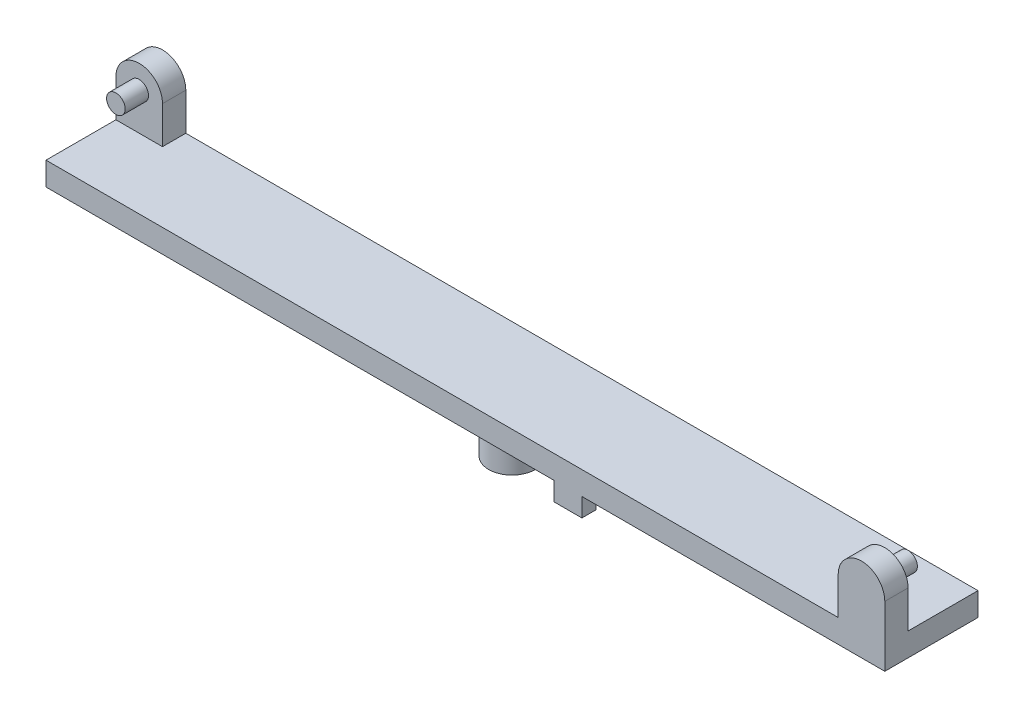
ISO-10303-21;
HEADER;
FILE_DESCRIPTION(('STEP AP214'),'2;1');
FILE_NAME('part.step','',(''),(''),'','','');
FILE_SCHEMA(('AUTOMOTIVE_DESIGN { 1 0 10303 214 1 1 1 1 }'));
ENDSEC;
DATA;
#1=APPLICATION_CONTEXT('core data for automotive mechanical design processes');
#2=APPLICATION_PROTOCOL_DEFINITION('international standard','automotive_design',2000,#1);
#3=PRODUCT_CONTEXT('',#1,'mechanical');
#4=PRODUCT('Part','Part','',(#3));
#5=PRODUCT_RELATED_PRODUCT_CATEGORY('part','',(#4));
#6=PRODUCT_DEFINITION_FORMATION('','',#4);
#7=PRODUCT_DEFINITION_CONTEXT('part definition',#1,'design');
#8=PRODUCT_DEFINITION('design','',#6,#7);
#9=PRODUCT_DEFINITION_SHAPE('','',#8);
#10=(LENGTH_UNIT() NAMED_UNIT(*) SI_UNIT(.MILLI.,.METRE.));
#11=(NAMED_UNIT(*) PLANE_ANGLE_UNIT() SI_UNIT($,.RADIAN.));
#12=(NAMED_UNIT(*) SI_UNIT($,.STERADIAN.) SOLID_ANGLE_UNIT());
#13=UNCERTAINTY_MEASURE_WITH_UNIT(LENGTH_MEASURE(1.E-05),#10,'distance_accuracy_value','');
#14=(GEOMETRIC_REPRESENTATION_CONTEXT(3) GLOBAL_UNCERTAINTY_ASSIGNED_CONTEXT((#13)) GLOBAL_UNIT_ASSIGNED_CONTEXT((#10,
#11,#12)) REPRESENTATION_CONTEXT('',''));
#15=CARTESIAN_POINT('',(0.,0.,0.));
#16=DIRECTION('',(0.,0.,1.));
#17=DIRECTION('',(1.,0.,0.));
#18=AXIS2_PLACEMENT_3D('',#15,#16,#17);
#19=CARTESIAN_POINT('',(0.,5.,10.));
#20=DIRECTION('',(0.,0.,-1.));
#21=DIRECTION('',(-1.,0.,0.));
#22=AXIS2_PLACEMENT_3D('',#19,#20,#21);
#23=PLANE('',#22);
#24=DIRECTION('',(1.,0.,0.));
#25=VECTOR('',#24,1.);
#26=CARTESIAN_POINT('',(0.,0.,10.));
#27=LINE('',#26,#25);
#28=CARTESIAN_POINT('',(-90.,0.,10.));
#29=VERTEX_POINT('',#28);
#30=CARTESIAN_POINT('',(19.,0.,10.));
#31=VERTEX_POINT('',#30);
#32=EDGE_CURVE('E276',#29,#31,#27,.T.);
#33=ORIENTED_EDGE('',*,*,#32,.T.);
#34=DIRECTION('',(0.,-1.,0.));
#35=VECTOR('',#34,1.);
#36=CARTESIAN_POINT('',(19.,0.,10.));
#37=LINE('',#36,#35);
#38=CARTESIAN_POINT('',(19.,-4.,10.));
#39=VERTEX_POINT('',#38);
#40=EDGE_CURVE('E166',#31,#39,#37,.T.);
#41=ORIENTED_EDGE('',*,*,#40,.T.);
#42=DIRECTION('',(1.,0.,0.));
#43=VECTOR('',#42,1.);
#44=CARTESIAN_POINT('',(19.,-4.,10.));
#45=LINE('',#44,#43);
#46=CARTESIAN_POINT('',(25.,-4.,10.));
#47=VERTEX_POINT('',#46);
#48=EDGE_CURVE('E142',#39,#47,#45,.T.);
#49=ORIENTED_EDGE('',*,*,#48,.T.);
#50=DIRECTION('',(0.,1.,0.));
#51=VECTOR('',#50,1.);
#52=CARTESIAN_POINT('',(25.,0.,10.));
#53=LINE('',#52,#51);
#54=CARTESIAN_POINT('',(25.,0.,10.));
#55=VERTEX_POINT('',#54);
#56=EDGE_CURVE('E51',#47,#55,#53,.T.);
#57=ORIENTED_EDGE('',*,*,#56,.T.);
#58=CARTESIAN_POINT('',(90.,0.,10.));
#59=VERTEX_POINT('',#58);
#60=EDGE_CURVE('E250',#55,#59,#27,.T.);
#61=ORIENTED_EDGE('',*,*,#60,.T.);
#62=DIRECTION('',(0.,-1.,0.));
#63=VECTOR('',#62,1.);
#64=CARTESIAN_POINT('',(90.,5.,10.));
#65=LINE('',#64,#63);
#66=CARTESIAN_POINT('',(90.,13.,10.));
#67=VERTEX_POINT('',#66);
#68=EDGE_CURVE('E44',#67,#59,#65,.T.);
#69=ORIENTED_EDGE('',*,*,#68,.F.);
#70=CARTESIAN_POINT('',(85.,13.,10.));
#71=DIRECTION('',(0.,0.,1.));
#72=DIRECTION('',(1.,0.,0.));
#73=AXIS2_PLACEMENT_3D('',#70,#71,#72);
#74=CIRCLE('',#73,4.99999999999999);
#75=CARTESIAN_POINT('',(80.,13.,10.));
#76=VERTEX_POINT('',#75);
#77=EDGE_CURVE('E183',#67,#76,#74,.T.);
#78=ORIENTED_EDGE('',*,*,#77,.T.);
#79=DIRECTION('',(0.,-1.,0.));
#80=VECTOR('',#79,1.);
#81=CARTESIAN_POINT('',(80.,0.,10.));
#82=LINE('',#81,#80);
#83=CARTESIAN_POINT('',(80.,5.,10.));
#84=VERTEX_POINT('',#83);
#85=EDGE_CURVE('E190',#76,#84,#82,.T.);
#86=ORIENTED_EDGE('',*,*,#85,.T.);
#87=DIRECTION('',(1.,0.,0.));
#88=VECTOR('',#87,1.);
#89=CARTESIAN_POINT('',(0.,5.,10.));
#90=LINE('',#89,#88);
#91=CARTESIAN_POINT('',(-90.,5.,10.));
#92=VERTEX_POINT('',#91);
#93=EDGE_CURVE('E251',#92,#84,#90,.T.);
#94=ORIENTED_EDGE('',*,*,#93,.F.);
#95=DIRECTION('',(0.,-1.,0.));
#96=VECTOR('',#95,1.);
#97=CARTESIAN_POINT('',(-90.,5.,10.));
#98=LINE('',#97,#96);
#99=EDGE_CURVE('E267',#92,#29,#98,.T.);
#100=ORIENTED_EDGE('',*,*,#99,.T.);
#101=EDGE_LOOP('',(#33,#41,#49,#57,#61,#69,#78,#86,#94,#100));
#102=FACE_BOUND('',#101,.T.);
#103=ADVANCED_FACE('F37',(#102),#23,.F.);
#104=CARTESIAN_POINT('',(90.,5.,0.));
#105=DIRECTION('',(-1.,0.,0.));
#106=DIRECTION('',(0.,0.,1.));
#107=AXIS2_PLACEMENT_3D('',#104,#105,#106);
#108=PLANE('',#107);
#109=DIRECTION('',(0.,0.,-1.));
#110=VECTOR('',#109,1.);
#111=CARTESIAN_POINT('',(90.,0.,0.));
#112=LINE('',#111,#110);
#113=CARTESIAN_POINT('',(90.,0.,-10.));
#114=VERTEX_POINT('',#113);
#115=EDGE_CURVE('E274',#59,#114,#112,.T.);
#116=ORIENTED_EDGE('',*,*,#115,.T.);
#117=DIRECTION('',(0.,-1.,0.));
#118=VECTOR('',#117,1.);
#119=CARTESIAN_POINT('',(90.,5.,-10.));
#120=LINE('',#119,#118);
#121=CARTESIAN_POINT('',(90.,5.,-10.));
#122=VERTEX_POINT('',#121);
#123=EDGE_CURVE('E263',#122,#114,#120,.T.);
#124=ORIENTED_EDGE('',*,*,#123,.F.);
#125=DIRECTION('',(0.,0.,-1.));
#126=VECTOR('',#125,1.);
#127=CARTESIAN_POINT('',(90.,5.,0.));
#128=LINE('',#127,#126);
#129=CARTESIAN_POINT('',(90.,5.,5.));
#130=VERTEX_POINT('',#129);
#131=EDGE_CURVE('E253',#130,#122,#128,.T.);
#132=ORIENTED_EDGE('',*,*,#131,.F.);
#133=DIRECTION('',(0.,1.,0.));
#134=VECTOR('',#133,1.);
#135=CARTESIAN_POINT('',(90.,1.56125112837913E-13,5.));
#136=LINE('',#135,#134);
#137=CARTESIAN_POINT('',(90.,13.,5.));
#138=VERTEX_POINT('',#137);
#139=EDGE_CURVE('E186',#130,#138,#136,.T.);
#140=ORIENTED_EDGE('',*,*,#139,.T.);
#141=DIRECTION('',(0.,0.,1.));
#142=VECTOR('',#141,1.);
#143=CARTESIAN_POINT('',(90.,13.,5.));
#144=LINE('',#143,#142);
#145=EDGE_CURVE('E197',#138,#67,#144,.T.);
#146=ORIENTED_EDGE('',*,*,#145,.T.);
#147=ORIENTED_EDGE('',*,*,#68,.T.);
#148=EDGE_LOOP('',(#116,#124,#132,#140,#146,#147));
#149=FACE_BOUND('',#148,.T.);
#150=ADVANCED_FACE('F287',(#149),#108,.F.);
#151=CARTESIAN_POINT('',(0.,5.,-10.));
#152=DIRECTION('',(0.,0.,-1.));
#153=DIRECTION('',(-1.,0.,0.));
#154=AXIS2_PLACEMENT_3D('',#151,#152,#153);
#155=PLANE('',#154);
#156=DIRECTION('',(1.,0.,0.));
#157=VECTOR('',#156,1.);
#158=CARTESIAN_POINT('',(0.,0.,-10.));
#159=LINE('',#158,#157);
#160=CARTESIAN_POINT('',(-90.,0.,-10.));
#161=VERTEX_POINT('',#160);
#162=EDGE_CURVE('E271',#161,#114,#159,.T.);
#163=ORIENTED_EDGE('',*,*,#162,.F.);
#164=DIRECTION('',(0.,-1.,0.));
#165=VECTOR('',#164,1.);
#166=CARTESIAN_POINT('',(-90.,5.,-10.));
#167=LINE('',#166,#165);
#168=CARTESIAN_POINT('',(-90.,13.,-10.));
#169=VERTEX_POINT('',#168);
#170=EDGE_CURVE('E265',#169,#161,#167,.T.);
#171=ORIENTED_EDGE('',*,*,#170,.F.);
#172=CARTESIAN_POINT('',(-85.,13.,-10.));
#173=DIRECTION('',(0.,0.,1.));
#174=DIRECTION('',(1.,0.,0.));
#175=AXIS2_PLACEMENT_3D('',#172,#173,#174);
#176=CIRCLE('',#175,4.99999999999999);
#177=CARTESIAN_POINT('',(-80.,13.,-10.));
#178=VERTEX_POINT('',#177);
#179=EDGE_CURVE('E210',#169,#178,#176,.F.);
#180=ORIENTED_EDGE('',*,*,#179,.T.);
#181=DIRECTION('',(0.,-1.,0.));
#182=VECTOR('',#181,1.);
#183=CARTESIAN_POINT('',(-80.,0.,-10.));
#184=LINE('',#183,#182);
#185=CARTESIAN_POINT('',(-80.,5.,-10.));
#186=VERTEX_POINT('',#185);
#187=EDGE_CURVE('E215',#178,#186,#184,.T.);
#188=ORIENTED_EDGE('',*,*,#187,.T.);
#189=DIRECTION('',(1.,0.,0.));
#190=VECTOR('',#189,1.);
#191=CARTESIAN_POINT('',(0.,5.,-10.));
#192=LINE('',#191,#190);
#193=EDGE_CURVE('E256',#186,#122,#192,.T.);
#194=ORIENTED_EDGE('',*,*,#193,.T.);
#195=ORIENTED_EDGE('',*,*,#123,.T.);
#196=EDGE_LOOP('',(#163,#171,#180,#188,#194,#195));
#197=FACE_BOUND('',#196,.T.);
#198=ADVANCED_FACE('F304',(#197),#155,.T.);
#199=CARTESIAN_POINT('',(-90.,5.,0.));
#200=DIRECTION('',(-1.,0.,0.));
#201=DIRECTION('',(0.,0.,1.));
#202=AXIS2_PLACEMENT_3D('',#199,#200,#201);
#203=PLANE('',#202);
#204=DIRECTION('',(0.,0.,-1.));
#205=VECTOR('',#204,1.);
#206=CARTESIAN_POINT('',(-90.,0.,0.));
#207=LINE('',#206,#205);
#208=EDGE_CURVE('E254',#29,#161,#207,.T.);
#209=ORIENTED_EDGE('',*,*,#208,.F.);
#210=ORIENTED_EDGE('',*,*,#99,.F.);
#211=DIRECTION('',(0.,0.,-1.));
#212=VECTOR('',#211,1.);
#213=CARTESIAN_POINT('',(-90.,5.,0.));
#214=LINE('',#213,#212);
#215=CARTESIAN_POINT('',(-90.,5.,-5.));
#216=VERTEX_POINT('',#215);
#217=EDGE_CURVE('E225',#92,#216,#214,.T.);
#218=ORIENTED_EDGE('',*,*,#217,.T.);
#219=DIRECTION('',(0.,1.,0.));
#220=VECTOR('',#219,1.);
#221=CARTESIAN_POINT('',(-90.,1.56125112837913E-13,-5.));
#222=LINE('',#221,#220);
#223=CARTESIAN_POINT('',(-90.,13.,-5.));
#224=VERTEX_POINT('',#223);
#225=EDGE_CURVE('E214',#216,#224,#222,.T.);
#226=ORIENTED_EDGE('',*,*,#225,.T.);
#227=DIRECTION('',(0.,0.,-1.));
#228=VECTOR('',#227,1.);
#229=CARTESIAN_POINT('',(-90.,13.,-5.));
#230=LINE('',#229,#228);
#231=EDGE_CURVE('E234',#224,#169,#230,.T.);
#232=ORIENTED_EDGE('',*,*,#231,.T.);
#233=ORIENTED_EDGE('',*,*,#170,.T.);
#234=EDGE_LOOP('',(#209,#210,#218,#226,#232,#233));
#235=FACE_BOUND('',#234,.T.);
#236=ADVANCED_FACE('F316',(#235),#203,.T.);
#237=CARTESIAN_POINT('',(0.,5.,0.));
#238=DIRECTION('',(0.,1.,0.));
#239=DIRECTION('',(0.,0.,1.));
#240=AXIS2_PLACEMENT_3D('',#237,#238,#239);
#241=PLANE('',#240);
#242=DIRECTION('',(0.,0.,1.));
#243=VECTOR('',#242,1.);
#244=CARTESIAN_POINT('',(80.,5.,5.));
#245=LINE('',#244,#243);
#246=CARTESIAN_POINT('',(80.,5.,5.));
#247=VERTEX_POINT('',#246);
#248=EDGE_CURVE('E59',#247,#84,#245,.T.);
#249=ORIENTED_EDGE('',*,*,#248,.F.);
#250=DIRECTION('',(1.,0.,0.));
#251=VECTOR('',#250,1.);
#252=CARTESIAN_POINT('',(0.,4.99999999999999,5.));
#253=LINE('',#252,#251);
#254=EDGE_CURVE('E195',#247,#130,#253,.T.);
#255=ORIENTED_EDGE('',*,*,#254,.T.);
#256=ORIENTED_EDGE('',*,*,#131,.T.);
#257=ORIENTED_EDGE('',*,*,#193,.F.);
#258=DIRECTION('',(0.,0.,-1.));
#259=VECTOR('',#258,1.);
#260=CARTESIAN_POINT('',(-80.,5.,-5.));
#261=LINE('',#260,#259);
#262=CARTESIAN_POINT('',(-80.,5.,-5.));
#263=VERTEX_POINT('',#262);
#264=EDGE_CURVE('E232',#263,#186,#261,.T.);
#265=ORIENTED_EDGE('',*,*,#264,.F.);
#266=DIRECTION('',(-1.,0.,0.));
#267=VECTOR('',#266,1.);
#268=CARTESIAN_POINT('',(0.,4.99999999999999,-5.));
#269=LINE('',#268,#267);
#270=EDGE_CURVE('E221',#263,#216,#269,.T.);
#271=ORIENTED_EDGE('',*,*,#270,.T.);
#272=ORIENTED_EDGE('',*,*,#217,.F.);
#273=ORIENTED_EDGE('',*,*,#93,.T.);
#274=EDGE_LOOP('',(#249,#255,#256,#257,#265,#271,#272,#273));
#275=FACE_BOUND('',#274,.T.);
#276=ADVANCED_FACE('F303',(#275),#241,.T.);
#277=CARTESIAN_POINT('',(0.,0.,0.));
#278=DIRECTION('',(0.,1.,0.));
#279=DIRECTION('',(0.,0.,1.));
#280=AXIS2_PLACEMENT_3D('',#277,#278,#279);
#281=PLANE('',#280);
#282=CARTESIAN_POINT('',(0.,0.,0.));
#283=DIRECTION('',(0.,1.,0.));
#284=DIRECTION('',(0.,0.,1.));
#285=AXIS2_PLACEMENT_3D('',#282,#283,#284);
#286=CIRCLE('',#285,5.);
#287=CARTESIAN_POINT('',(0.,0.,5.));
#288=VERTEX_POINT('',#287);
#289=EDGE_CURVE('E170',#288,#288,#286,.T.);
#290=ORIENTED_EDGE('',*,*,#289,.T.);
#291=EDGE_LOOP('',(#290));
#292=FACE_BOUND('',#291,.T.);
#293=DIRECTION('',(-1.,0.,0.));
#294=VECTOR('',#293,1.);
#295=CARTESIAN_POINT('',(19.,0.,7.));
#296=LINE('',#295,#294);
#297=CARTESIAN_POINT('',(25.,0.,7.));
#298=VERTEX_POINT('',#297);
#299=CARTESIAN_POINT('',(19.,0.,7.));
#300=VERTEX_POINT('',#299);
#301=EDGE_CURVE('E147',#298,#300,#296,.T.);
#302=ORIENTED_EDGE('',*,*,#301,.T.);
#303=DIRECTION('',(0.,0.,1.));
#304=VECTOR('',#303,1.);
#305=CARTESIAN_POINT('',(19.,0.,7.));
#306=LINE('',#305,#304);
#307=EDGE_CURVE('E160',#300,#31,#306,.T.);
#308=ORIENTED_EDGE('',*,*,#307,.T.);
#309=ORIENTED_EDGE('',*,*,#32,.F.);
#310=ORIENTED_EDGE('',*,*,#208,.T.);
#311=ORIENTED_EDGE('',*,*,#162,.T.);
#312=ORIENTED_EDGE('',*,*,#115,.F.);
#313=ORIENTED_EDGE('',*,*,#60,.F.);
#314=DIRECTION('',(0.,0.,1.));
#315=VECTOR('',#314,1.);
#316=CARTESIAN_POINT('',(25.,0.,7.));
#317=LINE('',#316,#315);
#318=EDGE_CURVE('E171',#298,#55,#317,.T.);
#319=ORIENTED_EDGE('',*,*,#318,.F.);
#320=EDGE_LOOP('',(#302,#308,#309,#310,#311,#312,#313,#319));
#321=FACE_BOUND('',#320,.T.);
#322=ADVANCED_FACE('F283',(#292,#321),#281,.F.);
#323=CARTESIAN_POINT('',(-85.,13.,-5.));
#324=DIRECTION('',(0.,0.,-1.));
#325=DIRECTION('',(-1.,0.,0.));
#326=AXIS2_PLACEMENT_3D('',#323,#324,#325);
#327=CYLINDRICAL_SURFACE('',#326,4.99999999999999);
#328=ORIENTED_EDGE('',*,*,#179,.F.);
#329=ORIENTED_EDGE('',*,*,#231,.F.);
#330=CARTESIAN_POINT('',(-85.,13.,-5.));
#331=DIRECTION('',(0.,0.,1.));
#332=DIRECTION('',(1.,0.,0.));
#333=AXIS2_PLACEMENT_3D('',#330,#331,#332);
#334=CIRCLE('',#333,4.99999999999999);
#335=CARTESIAN_POINT('',(-80.,13.,-5.));
#336=VERTEX_POINT('',#335);
#337=EDGE_CURVE('E211',#224,#336,#334,.F.);
#338=ORIENTED_EDGE('',*,*,#337,.T.);
#339=DIRECTION('',(0.,0.,-1.));
#340=VECTOR('',#339,1.);
#341=CARTESIAN_POINT('',(-80.,13.,-5.));
#342=LINE('',#341,#340);
#343=EDGE_CURVE('E235',#336,#178,#342,.T.);
#344=ORIENTED_EDGE('',*,*,#343,.T.);
#345=EDGE_LOOP('',(#328,#329,#338,#344));
#346=FACE_BOUND('',#345,.T.);
#347=ADVANCED_FACE('F343',(#346),#327,.T.);
#348=CARTESIAN_POINT('',(-80.,0.,-5.));
#349=DIRECTION('',(1.,0.,0.));
#350=DIRECTION('',(0.,0.,-1.));
#351=AXIS2_PLACEMENT_3D('',#348,#349,#350);
#352=PLANE('',#351);
#353=ORIENTED_EDGE('',*,*,#187,.F.);
#354=ORIENTED_EDGE('',*,*,#343,.F.);
#355=DIRECTION('',(0.,-1.,0.));
#356=VECTOR('',#355,1.);
#357=CARTESIAN_POINT('',(-80.,0.,-5.));
#358=LINE('',#357,#356);
#359=EDGE_CURVE('E218',#336,#263,#358,.T.);
#360=ORIENTED_EDGE('',*,*,#359,.T.);
#361=ORIENTED_EDGE('',*,*,#264,.T.);
#362=EDGE_LOOP('',(#353,#354,#360,#361));
#363=FACE_BOUND('',#362,.T.);
#364=ADVANCED_FACE('F309',(#363),#352,.T.);
#365=CARTESIAN_POINT('',(0.,0.,-5.));
#366=DIRECTION('',(0.,0.,1.));
#367=DIRECTION('',(1.,0.,0.));
#368=AXIS2_PLACEMENT_3D('',#365,#366,#367);
#369=PLANE('',#368);
#370=CARTESIAN_POINT('',(-85.,13.,-5.));
#371=DIRECTION('',(0.,0.,1.));
#372=DIRECTION('',(1.,0.,0.));
#373=AXIS2_PLACEMENT_3D('',#370,#371,#372);
#374=CIRCLE('',#373,2.);
#375=CARTESIAN_POINT('',(-83.,13.,-5.));
#376=VERTEX_POINT('',#375);
#377=EDGE_CURVE('E11',#376,#376,#374,.T.);
#378=ORIENTED_EDGE('',*,*,#377,.F.);
#379=EDGE_LOOP('',(#378));
#380=FACE_BOUND('',#379,.T.);
#381=ORIENTED_EDGE('',*,*,#337,.F.);
#382=ORIENTED_EDGE('',*,*,#225,.F.);
#383=ORIENTED_EDGE('',*,*,#270,.F.);
#384=ORIENTED_EDGE('',*,*,#359,.F.);
#385=EDGE_LOOP('',(#381,#382,#383,#384));
#386=FACE_BOUND('',#385,.T.);
#387=ADVANCED_FACE('F313',(#380,#386),#369,.T.);
#388=CARTESIAN_POINT('',(-85.,13.,-10.6568542494924));
#389=DIRECTION('',(0.,0.,1.));
#390=DIRECTION('',(1.,0.,0.));
#391=AXIS2_PLACEMENT_3D('',#388,#389,#390);
#392=CYLINDRICAL_SURFACE('',#391,2.);
#393=ORIENTED_EDGE('',*,*,#377,.T.);
#394=EDGE_LOOP('',(#393));
#395=FACE_BOUND('',#394,.T.);
#396=CARTESIAN_POINT('',(-85.,13.,0.));
#397=DIRECTION('',(0.,0.,1.));
#398=DIRECTION('',(1.,0.,0.));
#399=AXIS2_PLACEMENT_3D('',#396,#397,#398);
#400=CIRCLE('',#399,2.);
#401=CARTESIAN_POINT('',(-83.,13.,0.));
#402=VERTEX_POINT('',#401);
#403=EDGE_CURVE('E203',#402,#402,#400,.T.);
#404=ORIENTED_EDGE('',*,*,#403,.F.);
#405=EDGE_LOOP('',(#404));
#406=FACE_BOUND('',#405,.T.);
#407=ADVANCED_FACE('F354',(#395,#406),#392,.T.);
#408=CARTESIAN_POINT('',(0.,0.,0.));
#409=DIRECTION('',(0.,0.,1.));
#410=DIRECTION('',(1.,0.,0.));
#411=AXIS2_PLACEMENT_3D('',#408,#409,#410);
#412=PLANE('',#411);
#413=ORIENTED_EDGE('',*,*,#403,.T.);
#414=EDGE_LOOP('',(#413));
#415=FACE_BOUND('',#414,.T.);
#416=ADVANCED_FACE('F358',(#415),#412,.T.);
#417=CARTESIAN_POINT('',(80.,0.,5.));
#418=DIRECTION('',(-1.,0.,0.));
#419=DIRECTION('',(0.,0.,1.));
#420=AXIS2_PLACEMENT_3D('',#417,#418,#419);
#421=PLANE('',#420);
#422=ORIENTED_EDGE('',*,*,#85,.F.);
#423=DIRECTION('',(0.,0.,1.));
#424=VECTOR('',#423,1.);
#425=CARTESIAN_POINT('',(80.,13.,5.));
#426=LINE('',#425,#424);
#427=CARTESIAN_POINT('',(80.,13.,5.));
#428=VERTEX_POINT('',#427);
#429=EDGE_CURVE('E204',#428,#76,#426,.T.);
#430=ORIENTED_EDGE('',*,*,#429,.F.);
#431=DIRECTION('',(0.,-1.,0.));
#432=VECTOR('',#431,1.);
#433=CARTESIAN_POINT('',(80.,0.,5.));
#434=LINE('',#433,#432);
#435=EDGE_CURVE('E193',#428,#247,#434,.T.);
#436=ORIENTED_EDGE('',*,*,#435,.T.);
#437=ORIENTED_EDGE('',*,*,#248,.T.);
#438=EDGE_LOOP('',(#422,#430,#436,#437));
#439=FACE_BOUND('',#438,.T.);
#440=ADVANCED_FACE('F298',(#439),#421,.T.);
#441=CARTESIAN_POINT('',(85.,13.,5.));
#442=DIRECTION('',(0.,0.,1.));
#443=DIRECTION('',(1.,0.,0.));
#444=AXIS2_PLACEMENT_3D('',#441,#442,#443);
#445=CYLINDRICAL_SURFACE('',#444,4.99999999999999);
#446=ORIENTED_EDGE('',*,*,#77,.F.);
#447=ORIENTED_EDGE('',*,*,#145,.F.);
#448=CARTESIAN_POINT('',(85.,13.,5.));
#449=DIRECTION('',(0.,0.,1.));
#450=DIRECTION('',(1.,0.,0.));
#451=AXIS2_PLACEMENT_3D('',#448,#449,#450);
#452=CIRCLE('',#451,4.99999999999999);
#453=EDGE_CURVE('E189',#138,#428,#452,.T.);
#454=ORIENTED_EDGE('',*,*,#453,.T.);
#455=ORIENTED_EDGE('',*,*,#429,.T.);
#456=EDGE_LOOP('',(#446,#447,#454,#455));
#457=FACE_BOUND('',#456,.T.);
#458=ADVANCED_FACE('F293',(#457),#445,.T.);
#459=CARTESIAN_POINT('',(0.,0.,5.));
#460=DIRECTION('',(0.,0.,1.));
#461=DIRECTION('',(1.,0.,0.));
#462=AXIS2_PLACEMENT_3D('',#459,#460,#461);
#463=PLANE('',#462);
#464=CARTESIAN_POINT('',(85.,13.,5.));
#465=DIRECTION('',(0.,0.,1.));
#466=DIRECTION('',(1.,0.,0.));
#467=AXIS2_PLACEMENT_3D('',#464,#465,#466);
#468=CIRCLE('',#467,2.);
#469=CARTESIAN_POINT('',(87.,13.,5.));
#470=VERTEX_POINT('',#469);
#471=EDGE_CURVE('E180',#470,#470,#468,.F.);
#472=ORIENTED_EDGE('',*,*,#471,.F.);
#473=EDGE_LOOP('',(#472));
#474=FACE_BOUND('',#473,.T.);
#475=ORIENTED_EDGE('',*,*,#139,.F.);
#476=ORIENTED_EDGE('',*,*,#254,.F.);
#477=ORIENTED_EDGE('',*,*,#435,.F.);
#478=ORIENTED_EDGE('',*,*,#453,.F.);
#479=EDGE_LOOP('',(#475,#476,#477,#478));
#480=FACE_BOUND('',#479,.T.);
#481=ADVANCED_FACE('F302',(#474,#480),#463,.F.);
#482=CARTESIAN_POINT('',(85.,13.,5.));
#483=DIRECTION('',(0.,0.,-1.));
#484=DIRECTION('',(-1.,0.,0.));
#485=AXIS2_PLACEMENT_3D('',#482,#483,#484);
#486=CYLINDRICAL_SURFACE('',#485,2.);
#487=ORIENTED_EDGE('',*,*,#471,.T.);
#488=EDGE_LOOP('',(#487));
#489=FACE_BOUND('',#488,.T.);
#490=CARTESIAN_POINT('',(85.,13.,0.));
#491=DIRECTION('',(0.,0.,1.));
#492=DIRECTION('',(1.,0.,0.));
#493=AXIS2_PLACEMENT_3D('',#490,#491,#492);
#494=CIRCLE('',#493,2.);
#495=CARTESIAN_POINT('',(87.,13.,0.));
#496=VERTEX_POINT('',#495);
#497=EDGE_CURVE('E177',#496,#496,#494,.F.);
#498=ORIENTED_EDGE('',*,*,#497,.F.);
#499=EDGE_LOOP('',(#498));
#500=FACE_BOUND('',#499,.T.);
#501=ADVANCED_FACE('F369',(#489,#500),#486,.T.);
#502=CARTESIAN_POINT('',(0.,0.,0.));
#503=DIRECTION('',(0.,0.,1.));
#504=DIRECTION('',(1.,0.,0.));
#505=AXIS2_PLACEMENT_3D('',#502,#503,#504);
#506=PLANE('',#505);
#507=ORIENTED_EDGE('',*,*,#497,.T.);
#508=EDGE_LOOP('',(#507));
#509=FACE_BOUND('',#508,.T.);
#510=ADVANCED_FACE('F373',(#509),#506,.F.);
#511=CARTESIAN_POINT('',(0.,-10.,0.));
#512=DIRECTION('',(0.,1.,0.));
#513=DIRECTION('',(0.,0.,1.));
#514=AXIS2_PLACEMENT_3D('',#511,#512,#513);
#515=CYLINDRICAL_SURFACE('',#514,5.);
#516=CARTESIAN_POINT('',(0.,-10.,0.));
#517=DIRECTION('',(0.,1.,0.));
#518=DIRECTION('',(0.,0.,1.));
#519=AXIS2_PLACEMENT_3D('',#516,#517,#518);
#520=CIRCLE('',#519,5.);
#521=CARTESIAN_POINT('',(0.,-10.,5.));
#522=VERTEX_POINT('',#521);
#523=EDGE_CURVE('E174',#522,#522,#520,.T.);
#524=ORIENTED_EDGE('',*,*,#523,.T.);
#525=EDGE_LOOP('',(#524));
#526=FACE_BOUND('',#525,.T.);
#527=ORIENTED_EDGE('',*,*,#289,.F.);
#528=EDGE_LOOP('',(#527));
#529=FACE_BOUND('',#528,.T.);
#530=ADVANCED_FACE('F377',(#526,#529),#515,.T.);
#531=CARTESIAN_POINT('',(0.,-10.,0.));
#532=DIRECTION('',(0.,1.,0.));
#533=DIRECTION('',(0.,0.,1.));
#534=AXIS2_PLACEMENT_3D('',#531,#532,#533);
#535=PLANE('',#534);
#536=ORIENTED_EDGE('',*,*,#523,.F.);
#537=EDGE_LOOP('',(#536));
#538=FACE_BOUND('',#537,.T.);
#539=ADVANCED_FACE('F326',(#538),#535,.F.);
#540=CARTESIAN_POINT('',(19.,0.,7.));
#541=DIRECTION('',(-1.,0.,0.));
#542=DIRECTION('',(0.,-1.,0.));
#543=AXIS2_PLACEMENT_3D('',#540,#541,#542);
#544=PLANE('',#543);
#545=ORIENTED_EDGE('',*,*,#40,.F.);
#546=ORIENTED_EDGE('',*,*,#307,.F.);
#547=DIRECTION('',(0.,-1.,0.));
#548=VECTOR('',#547,1.);
#549=CARTESIAN_POINT('',(19.,0.,7.));
#550=LINE('',#549,#548);
#551=CARTESIAN_POINT('',(19.,-4.,7.));
#552=VERTEX_POINT('',#551);
#553=EDGE_CURVE('E154',#300,#552,#550,.T.);
#554=ORIENTED_EDGE('',*,*,#553,.T.);
#555=DIRECTION('',(0.,0.,1.));
#556=VECTOR('',#555,1.);
#557=CARTESIAN_POINT('',(19.,-4.,7.));
#558=LINE('',#557,#556);
#559=EDGE_CURVE('E138',#552,#39,#558,.T.);
#560=ORIENTED_EDGE('',*,*,#559,.T.);
#561=EDGE_LOOP('',(#545,#546,#554,#560));
#562=FACE_BOUND('',#561,.T.);
#563=ADVANCED_FACE('F158',(#562),#544,.T.);
#564=CARTESIAN_POINT('',(25.,0.,7.));
#565=DIRECTION('',(1.,0.,0.));
#566=DIRECTION('',(0.,0.,-1.));
#567=AXIS2_PLACEMENT_3D('',#564,#565,#566);
#568=PLANE('',#567);
#569=ORIENTED_EDGE('',*,*,#56,.F.);
#570=DIRECTION('',(0.,0.,1.));
#571=VECTOR('',#570,1.);
#572=CARTESIAN_POINT('',(25.,-4.,7.));
#573=LINE('',#572,#571);
#574=CARTESIAN_POINT('',(25.,-4.,7.));
#575=VERTEX_POINT('',#574);
#576=EDGE_CURVE('E146',#575,#47,#573,.T.);
#577=ORIENTED_EDGE('',*,*,#576,.F.);
#578=DIRECTION('',(0.,1.,0.));
#579=VECTOR('',#578,1.);
#580=CARTESIAN_POINT('',(25.,0.,7.));
#581=LINE('',#580,#579);
#582=EDGE_CURVE('E156',#575,#298,#581,.T.);
#583=ORIENTED_EDGE('',*,*,#582,.T.);
#584=ORIENTED_EDGE('',*,*,#318,.T.);
#585=EDGE_LOOP('',(#569,#577,#583,#584));
#586=FACE_BOUND('',#585,.T.);
#587=ADVANCED_FACE('F318',(#586),#568,.T.);
#588=CARTESIAN_POINT('',(19.,-4.,7.));
#589=DIRECTION('',(0.,-1.,0.));
#590=DIRECTION('',(1.,0.,0.));
#591=AXIS2_PLACEMENT_3D('',#588,#589,#590);
#592=PLANE('',#591);
#593=ORIENTED_EDGE('',*,*,#48,.F.);
#594=ORIENTED_EDGE('',*,*,#559,.F.);
#595=DIRECTION('',(1.,0.,0.));
#596=VECTOR('',#595,1.);
#597=CARTESIAN_POINT('',(19.,-4.,7.));
#598=LINE('',#597,#596);
#599=EDGE_CURVE('E141',#552,#575,#598,.T.);
#600=ORIENTED_EDGE('',*,*,#599,.T.);
#601=ORIENTED_EDGE('',*,*,#576,.T.);
#602=EDGE_LOOP('',(#593,#594,#600,#601));
#603=FACE_BOUND('',#602,.T.);
#604=ADVANCED_FACE('F140',(#603),#592,.T.);
#605=CARTESIAN_POINT('',(0.,0.,7.));
#606=DIRECTION('',(0.,0.,1.));
#607=DIRECTION('',(1.,0.,0.));
#608=AXIS2_PLACEMENT_3D('',#605,#606,#607);
#609=PLANE('',#608);
#610=ORIENTED_EDGE('',*,*,#553,.F.);
#611=ORIENTED_EDGE('',*,*,#301,.F.);
#612=ORIENTED_EDGE('',*,*,#582,.F.);
#613=ORIENTED_EDGE('',*,*,#599,.F.);
#614=EDGE_LOOP('',(#610,#611,#612,#613));
#615=FACE_BOUND('',#614,.T.);
#616=ADVANCED_FACE('F152',(#615),#609,.F.);
#617=CLOSED_SHELL('',(#103,#150,#198,#236,#276,#322,#347,#364,#387,#407,#416,#440,#458,#481,
#501,#510,#530,#539,#563,#587,#604,#616));
#618=MANIFOLD_SOLID_BREP('B2',#617);
#619=ADVANCED_BREP_SHAPE_REPRESENTATION('',(#18,#618),#14);
#620=SHAPE_DEFINITION_REPRESENTATION(#9,#619);
ENDSEC;
END-ISO-10303-21;
